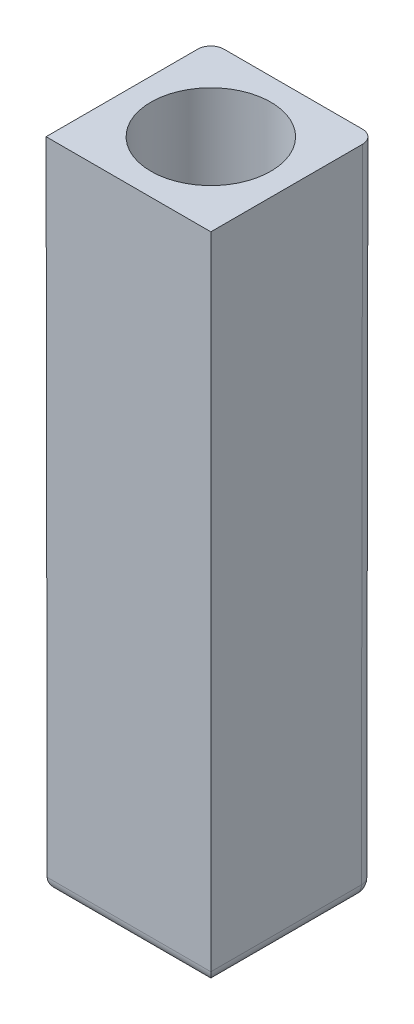
ISO-10303-21;
HEADER;
FILE_DESCRIPTION(('STEP AP214'),'2;1');
FILE_NAME('part.step','',(''),(''),'','','');
FILE_SCHEMA(('AUTOMOTIVE_DESIGN { 1 0 10303 214 1 1 1 1 }'));
ENDSEC;
DATA;
#1=APPLICATION_CONTEXT('core data for automotive mechanical design processes');
#2=APPLICATION_PROTOCOL_DEFINITION('international standard','automotive_design',2000,#1);
#3=PRODUCT_CONTEXT('',#1,'mechanical');
#4=PRODUCT('Part','Part','',(#3));
#5=PRODUCT_RELATED_PRODUCT_CATEGORY('part','',(#4));
#6=PRODUCT_DEFINITION_FORMATION('','',#4);
#7=PRODUCT_DEFINITION_CONTEXT('part definition',#1,'design');
#8=PRODUCT_DEFINITION('design','',#6,#7);
#9=PRODUCT_DEFINITION_SHAPE('','',#8);
#10=(LENGTH_UNIT() NAMED_UNIT(*) SI_UNIT(.MILLI.,.METRE.));
#11=(NAMED_UNIT(*) PLANE_ANGLE_UNIT() SI_UNIT($,.RADIAN.));
#12=(NAMED_UNIT(*) SI_UNIT($,.STERADIAN.) SOLID_ANGLE_UNIT());
#13=UNCERTAINTY_MEASURE_WITH_UNIT(LENGTH_MEASURE(1.E-05),#10,'distance_accuracy_value','');
#14=(GEOMETRIC_REPRESENTATION_CONTEXT(3) GLOBAL_UNCERTAINTY_ASSIGNED_CONTEXT((#13)) GLOBAL_UNIT_ASSIGNED_CONTEXT((#10,
#11,#12)) REPRESENTATION_CONTEXT('',''));
#15=CARTESIAN_POINT('',(0.,0.,0.));
#16=DIRECTION('',(0.,0.,1.));
#17=DIRECTION('',(1.,0.,0.));
#18=AXIS2_PLACEMENT_3D('',#15,#16,#17);
#19=CARTESIAN_POINT('',(0.,100.,0.));
#20=DIRECTION('',(0.,1.,0.));
#21=DIRECTION('',(0.,0.,1.));
#22=AXIS2_PLACEMENT_3D('',#19,#20,#21);
#23=PLANE('',#22);
#24=DIRECTION('',(0.,0.,1.));
#25=VECTOR('',#24,1.);
#26=CARTESIAN_POINT('',(12.5872664847521,100.,-12.5));
#27=LINE('',#26,#25);
#28=CARTESIAN_POINT('',(12.5872664847521,100.,12.5872664847521));
#29=VERTEX_POINT('',#28);
#30=CARTESIAN_POINT('',(12.5872664847521,100.,-10.5872672462956));
#31=VERTEX_POINT('',#30);
#32=EDGE_CURVE('E140',#29,#31,#27,.F.);
#33=ORIENTED_EDGE('',*,*,#32,.T.);
#34=CARTESIAN_POINT('',(10.5872657232083,100.,-10.5872657232083));
#35=DIRECTION('',(0.,1.,0.));
#36=DIRECTION('',(-0.707106781186548,0.,0.707106781186548));
#37=AXIS2_PLACEMENT_3D('',#34,#35,#36);
#38=ELLIPSE('',#37,2.00000152308729,2.);
#39=CARTESIAN_POINT('',(10.5872672462956,100.,-12.5872664847521));
#40=VERTEX_POINT('',#39);
#41=EDGE_CURVE('E153',#31,#40,#38,.T.);
#42=ORIENTED_EDGE('',*,*,#41,.T.);
#43=DIRECTION('',(1.,0.,0.));
#44=VECTOR('',#43,1.);
#45=CARTESIAN_POINT('',(-12.5,100.,-12.5872664847521));
#46=LINE('',#45,#44);
#47=CARTESIAN_POINT('',(-10.5872672462956,100.,-12.5872664847521));
#48=VERTEX_POINT('',#47);
#49=EDGE_CURVE('E118',#40,#48,#46,.F.);
#50=ORIENTED_EDGE('',*,*,#49,.T.);
#51=CARTESIAN_POINT('',(-10.5872657232083,100.,-10.5872657232083));
#52=DIRECTION('',(0.,1.,0.));
#53=DIRECTION('',(0.707106781186548,0.,0.707106781186548));
#54=AXIS2_PLACEMENT_3D('',#51,#52,#53);
#55=ELLIPSE('',#54,2.00000152308729,2.);
#56=CARTESIAN_POINT('',(-12.5872664847521,100.,-10.5872672462956));
#57=VERTEX_POINT('',#56);
#58=EDGE_CURVE('E115',#48,#57,#55,.T.);
#59=ORIENTED_EDGE('',*,*,#58,.T.);
#60=DIRECTION('',(0.,0.,-1.));
#61=VECTOR('',#60,1.);
#62=CARTESIAN_POINT('',(-12.5872664847521,100.,-12.5));
#63=LINE('',#62,#61);
#64=CARTESIAN_POINT('',(-12.5872664847521,100.,12.5872664847521));
#65=VERTEX_POINT('',#64);
#66=EDGE_CURVE('E106',#57,#65,#63,.F.);
#67=ORIENTED_EDGE('',*,*,#66,.T.);
#68=DIRECTION('',(-1.,0.,0.));
#69=VECTOR('',#68,1.);
#70=CARTESIAN_POINT('',(-12.5,100.,12.5872664847521));
#71=LINE('',#70,#69);
#72=EDGE_CURVE('E111',#65,#29,#71,.F.);
#73=ORIENTED_EDGE('',*,*,#72,.T.);
#74=EDGE_LOOP('',(#33,#42,#50,#59,#67,#73));
#75=FACE_BOUND('',#74,.T.);
#76=CARTESIAN_POINT('',(0.,100.,0.));
#77=DIRECTION('',(0.,1.,0.));
#78=DIRECTION('',(0.,0.,1.));
#79=AXIS2_PLACEMENT_3D('',#76,#77,#78);
#80=CIRCLE('',#79,9.15973351524787);
#81=CARTESIAN_POINT('',(0.,100.,9.15973351524787));
#82=VERTEX_POINT('',#81);
#83=EDGE_CURVE('E137',#82,#82,#80,.T.);
#84=ORIENTED_EDGE('',*,*,#83,.F.);
#85=EDGE_LOOP('',(#84));
#86=FACE_BOUND('',#85,.T.);
#87=ADVANCED_FACE('F39',(#75,#86),#23,.T.);
#88=CARTESIAN_POINT('',(0.,0.,0.));
#89=DIRECTION('',(0.,1.,0.));
#90=DIRECTION('',(0.,0.,1.));
#91=AXIS2_PLACEMENT_3D('',#88,#89,#90);
#92=PLANE('',#91);
#93=DIRECTION('',(1.,0.,0.));
#94=VECTOR('',#93,1.);
#95=CARTESIAN_POINT('',(0.,0.,-10.5017445681513));
#96=LINE('',#95,#94);
#97=CARTESIAN_POINT('',(-10.5017445681513,0.,-10.5017445681513));
#98=VERTEX_POINT('',#97);
#99=CARTESIAN_POINT('',(10.5017445681512,0.,-10.5017445681513));
#100=VERTEX_POINT('',#99);
#101=EDGE_CURVE('E158',#98,#100,#96,.T.);
#102=ORIENTED_EDGE('',*,*,#101,.T.);
#103=DIRECTION('',(0.,0.,1.));
#104=VECTOR('',#103,1.);
#105=CARTESIAN_POINT('',(10.5017445681512,0.,0.));
#106=LINE('',#105,#104);
#107=CARTESIAN_POINT('',(10.5017445681513,0.,10.5017445681513));
#108=VERTEX_POINT('',#107);
#109=EDGE_CURVE('E48',#100,#108,#106,.T.);
#110=ORIENTED_EDGE('',*,*,#109,.T.);
#111=DIRECTION('',(-1.,0.,0.));
#112=VECTOR('',#111,1.);
#113=CARTESIAN_POINT('',(0.,0.,10.5017445681513));
#114=LINE('',#113,#112);
#115=CARTESIAN_POINT('',(-10.5017445681513,0.,10.5017445681513));
#116=VERTEX_POINT('',#115);
#117=EDGE_CURVE('E63',#108,#116,#114,.T.);
#118=ORIENTED_EDGE('',*,*,#117,.T.);
#119=DIRECTION('',(0.,0.,-1.));
#120=VECTOR('',#119,1.);
#121=CARTESIAN_POINT('',(-10.5017445681513,0.,0.));
#122=LINE('',#121,#120);
#123=EDGE_CURVE('E160',#116,#98,#122,.T.);
#124=ORIENTED_EDGE('',*,*,#123,.T.);
#125=EDGE_LOOP('',(#102,#110,#118,#124));
#126=FACE_BOUND('',#125,.T.);
#127=CARTESIAN_POINT('',(0.,0.,0.));
#128=DIRECTION('',(0.,1.,0.));
#129=DIRECTION('',(0.,0.,1.));
#130=AXIS2_PLACEMENT_3D('',#127,#128,#129);
#131=CIRCLE('',#130,9.247);
#132=CARTESIAN_POINT('',(0.,0.,9.247));
#133=VERTEX_POINT('',#132);
#134=EDGE_CURVE('E141',#133,#133,#131,.T.);
#135=ORIENTED_EDGE('',*,*,#134,.T.);
#136=EDGE_LOOP('',(#135));
#137=FACE_BOUND('',#136,.T.);
#138=ADVANCED_FACE('F223',(#126,#137),#92,.F.);
#139=CARTESIAN_POINT('',(12.5,0.,-12.5));
#140=DIRECTION('',(0.999999619228249,-0.000872664515235152,0.));
#141=DIRECTION('',(0.000872664515235152,0.999999619228249,0.));
#142=AXIS2_PLACEMENT_3D('',#139,#140,#141);
#143=PLANE('',#142);
#144=DIRECTION('',(0.,0.,-1.));
#145=VECTOR('',#144,1.);
#146=CARTESIAN_POINT('',(12.5017438066077,1.99825467096953,-12.5));
#147=LINE('',#146,#145);
#148=CARTESIAN_POINT('',(12.5017438066078,1.99825467096953,12.5017438066078));
#149=VERTEX_POINT('',#148);
#150=CARTESIAN_POINT('',(12.5017438066077,1.99825467096953,-10.5017445681513));
#151=VERTEX_POINT('',#150);
#152=EDGE_CURVE('E148',#149,#151,#147,.T.);
#153=ORIENTED_EDGE('',*,*,#152,.T.);
#154=DIRECTION('',(0.000872664182949409,0.999999238456934,-0.00087266418294941));
#155=VECTOR('',#154,1.);
#156=CARTESIAN_POINT('',(12.500001523085,0.00174532637218487,-10.5000022846285));
#157=LINE('',#156,#155);
#158=EDGE_CURVE('E150',#151,#31,#157,.T.);
#159=ORIENTED_EDGE('',*,*,#158,.T.);
#160=ORIENTED_EDGE('',*,*,#32,.F.);
#161=DIRECTION('',(-0.00087266418294941,-0.999999238456934,-0.00087266418294941));
#162=VECTOR('',#161,1.);
#163=CARTESIAN_POINT('',(12.4999809614306,-0.0218165879594513,12.4999809614306));
#164=LINE('',#163,#162);
#165=EDGE_CURVE('E128',#29,#149,#164,.T.);
#166=ORIENTED_EDGE('',*,*,#165,.T.);
#167=EDGE_LOOP('',(#153,#159,#160,#166));
#168=FACE_BOUND('',#167,.T.);
#169=ADVANCED_FACE('F202',(#168),#143,.T.);
#170=CARTESIAN_POINT('',(-12.5,0.,-12.5));
#171=DIRECTION('',(0.,-0.000872664515235152,-0.999999619228249));
#172=DIRECTION('',(0.,0.999999619228249,-0.000872664515235152));
#173=AXIS2_PLACEMENT_3D('',#170,#171,#172);
#174=PLANE('',#173);
#175=ORIENTED_EDGE('',*,*,#49,.F.);
#176=DIRECTION('',(0.000872664182949409,0.999999238456934,-0.00087266418294941));
#177=VECTOR('',#176,1.);
#178=CARTESIAN_POINT('',(10.4999832460591,-0.0200712615872664,-12.4999824845156));
#179=LINE('',#178,#177);
#180=CARTESIAN_POINT('',(10.5017445681512,1.99825467096953,-12.5017438066077));
#181=VERTEX_POINT('',#180);
#182=EDGE_CURVE('E145',#40,#181,#179,.F.);
#183=ORIENTED_EDGE('',*,*,#182,.T.);
#184=DIRECTION('',(-1.,0.,0.));
#185=VECTOR('',#184,1.);
#186=CARTESIAN_POINT('',(-12.5,1.99825467096953,-12.5017438066077));
#187=LINE('',#186,#185);
#188=CARTESIAN_POINT('',(-10.5017445681513,1.99825467096953,-12.5017438066077));
#189=VERTEX_POINT('',#188);
#190=EDGE_CURVE('E127',#181,#189,#187,.T.);
#191=ORIENTED_EDGE('',*,*,#190,.T.);
#192=DIRECTION('',(-0.00087266418294941,0.999999238456934,-0.00087266418294941));
#193=VECTOR('',#192,1.);
#194=CARTESIAN_POINT('',(-10.5000022846285,0.00174532637218487,-12.500001523085));
#195=LINE('',#194,#193);
#196=EDGE_CURVE('E143',#189,#48,#195,.T.);
#197=ORIENTED_EDGE('',*,*,#196,.T.);
#198=EDGE_LOOP('',(#175,#183,#191,#197));
#199=FACE_BOUND('',#198,.T.);
#200=ADVANCED_FACE('F208',(#199),#174,.T.);
#201=CARTESIAN_POINT('',(-12.5,0.,-12.5));
#202=DIRECTION('',(-0.999999619228249,-0.000872664515235152,0.));
#203=DIRECTION('',(0.000872664515235152,-0.999999619228249,0.));
#204=AXIS2_PLACEMENT_3D('',#201,#202,#203);
#205=PLANE('',#204);
#206=ORIENTED_EDGE('',*,*,#66,.F.);
#207=DIRECTION('',(-0.00087266418294941,0.999999238456934,-0.00087266418294941));
#208=VECTOR('',#207,1.);
#209=CARTESIAN_POINT('',(-12.500001523085,0.00174532637218487,-10.5000022846285));
#210=LINE('',#209,#208);
#211=CARTESIAN_POINT('',(-12.5017438066078,1.99825467096953,-10.5017445681513));
#212=VERTEX_POINT('',#211);
#213=EDGE_CURVE('E156',#57,#212,#210,.F.);
#214=ORIENTED_EDGE('',*,*,#213,.T.);
#215=DIRECTION('',(0.,0.,1.));
#216=VECTOR('',#215,1.);
#217=CARTESIAN_POINT('',(-12.5017438066078,1.99825467096953,-12.5));
#218=LINE('',#217,#216);
#219=CARTESIAN_POINT('',(-12.5017438066078,1.99825467096953,12.5017438066078));
#220=VERTEX_POINT('',#219);
#221=EDGE_CURVE('E124',#212,#220,#218,.T.);
#222=ORIENTED_EDGE('',*,*,#221,.T.);
#223=DIRECTION('',(0.000872664182949409,-0.999999238456934,-0.00087266418294941));
#224=VECTOR('',#223,1.);
#225=CARTESIAN_POINT('',(-12.5,0.,12.5));
#226=LINE('',#225,#224);
#227=EDGE_CURVE('E121',#65,#220,#226,.T.);
#228=ORIENTED_EDGE('',*,*,#227,.F.);
#229=EDGE_LOOP('',(#206,#214,#222,#228));
#230=FACE_BOUND('',#229,.T.);
#231=ADVANCED_FACE('F122',(#230),#205,.T.);
#232=CARTESIAN_POINT('',(-12.5,0.,12.5));
#233=DIRECTION('',(0.,-0.000872664515235152,0.999999619228249));
#234=DIRECTION('',(0.,-0.999999619228249,-0.000872664515235152));
#235=AXIS2_PLACEMENT_3D('',#232,#233,#234);
#236=PLANE('',#235);
#237=ORIENTED_EDGE('',*,*,#227,.T.);
#238=DIRECTION('',(1.,0.,0.));
#239=VECTOR('',#238,1.);
#240=CARTESIAN_POINT('',(-12.5,1.99825467096953,12.5017438066078));
#241=LINE('',#240,#239);
#242=EDGE_CURVE('E11',#220,#149,#241,.T.);
#243=ORIENTED_EDGE('',*,*,#242,.T.);
#244=ORIENTED_EDGE('',*,*,#165,.F.);
#245=ORIENTED_EDGE('',*,*,#72,.F.);
#246=EDGE_LOOP('',(#237,#243,#244,#245));
#247=FACE_BOUND('',#246,.T.);
#248=ADVANCED_FACE('F130',(#247),#236,.T.);
#249=CARTESIAN_POINT('',(0.,0.,0.));
#250=DIRECTION('',(0.,-1.,0.));
#251=DIRECTION('',(0.,0.,1.));
#252=AXIS2_PLACEMENT_3D('',#249,#250,#251);
#253=CONICAL_SURFACE('',#252,9.247,0.000872664625997167);
#254=ORIENTED_EDGE('',*,*,#83,.T.);
#255=EDGE_LOOP('',(#254));
#256=FACE_BOUND('',#255,.T.);
#257=ORIENTED_EDGE('',*,*,#134,.F.);
#258=EDGE_LOOP('',(#257));
#259=FACE_BOUND('',#258,.T.);
#260=ADVANCED_FACE('F234',(#256,#259),#253,.F.);
#261=CARTESIAN_POINT('',(-10.5000022846285,0.00349065540265517,-10.5000022846285));
#262=DIRECTION('',(0.00087266418294941,-0.999999238456934,0.00087266418294941));
#263=DIRECTION('',(0.999999619228249,0.000872664515235152,0.));
#264=AXIS2_PLACEMENT_3D('',#261,#262,#263);
#265=CYLINDRICAL_SURFACE('',#264,2.);
#266=ORIENTED_EDGE('',*,*,#58,.F.);
#267=ORIENTED_EDGE('',*,*,#196,.F.);
#268=CARTESIAN_POINT('',(-10.5017445681513,2.,-10.5017445681513));
#269=DIRECTION('',(0.000872664182949483,-0.999999238456934,0.000872664182949483));
#270=DIRECTION('',(0.,-0.000872664515235225,-0.999999619228249));
#271=AXIS2_PLACEMENT_3D('',#268,#269,#270);
#272=CIRCLE('',#271,2.);
#273=EDGE_CURVE('E43',#212,#189,#272,.T.);
#274=ORIENTED_EDGE('',*,*,#273,.F.);
#275=ORIENTED_EDGE('',*,*,#213,.F.);
#276=EDGE_LOOP('',(#266,#267,#274,#275));
#277=FACE_BOUND('',#276,.T.);
#278=ADVANCED_FACE('F41',(#277),#265,.T.);
#279=CARTESIAN_POINT('',(-10.5017445681513,2.,-12.5));
#280=DIRECTION('',(0.,0.,-1.));
#281=DIRECTION('',(-1.,0.,0.));
#282=AXIS2_PLACEMENT_3D('',#279,#280,#281);
#283=CYLINDRICAL_SURFACE('',#282,2.);
#284=CARTESIAN_POINT('',(-10.5017445681513,2.,10.5017445681513));
#285=DIRECTION('',(-0.707106781186548,0.,-0.707106781186547));
#286=DIRECTION('',(0.707106781186547,0.,-0.707106781186548));
#287=AXIS2_PLACEMENT_3D('',#284,#285,#286);
#288=ELLIPSE('',#287,2.82842712474619,2.);
#289=EDGE_CURVE('E176',#220,#116,#288,.F.);
#290=ORIENTED_EDGE('',*,*,#289,.F.);
#291=ORIENTED_EDGE('',*,*,#221,.F.);
#292=CARTESIAN_POINT('',(-10.5017445681513,2.,-10.5017445681513));
#293=DIRECTION('',(0.,0.,-1.));
#294=DIRECTION('',(-1.,0.,0.));
#295=AXIS2_PLACEMENT_3D('',#292,#293,#294);
#296=CIRCLE('',#295,2.);
#297=EDGE_CURVE('E178',#98,#212,#296,.T.);
#298=ORIENTED_EDGE('',*,*,#297,.F.);
#299=ORIENTED_EDGE('',*,*,#123,.F.);
#300=EDGE_LOOP('',(#290,#291,#298,#299));
#301=FACE_BOUND('',#300,.T.);
#302=ADVANCED_FACE('F197',(#301),#283,.T.);
#303=CARTESIAN_POINT('',(-10.5017445681513,2.,-10.5017445681513));
#304=DIRECTION('',(0.,-1.,0.));
#305=DIRECTION('',(0.,0.,-1.));
#306=AXIS2_PLACEMENT_3D('',#303,#304,#305);
#307=SPHERICAL_SURFACE('',#306,2.);
#308=ORIENTED_EDGE('',*,*,#297,.T.);
#309=ORIENTED_EDGE('',*,*,#273,.T.);
#310=CARTESIAN_POINT('',(-10.5017445681513,2.,-10.5017445681512));
#311=DIRECTION('',(-1.,0.,0.));
#312=DIRECTION('',(0.,-1.,0.));
#313=AXIS2_PLACEMENT_3D('',#310,#311,#312);
#314=CIRCLE('',#313,2.);
#315=EDGE_CURVE('E173',#98,#189,#314,.F.);
#316=ORIENTED_EDGE('',*,*,#315,.F.);
#317=EDGE_LOOP('',(#308,#309,#316));
#318=FACE_BOUND('',#317,.T.);
#319=ADVANCED_FACE('F214',(#318),#307,.T.);
#320=CARTESIAN_POINT('',(-12.5,2.,10.5017445681513));
#321=DIRECTION('',(-1.,0.,0.));
#322=DIRECTION('',(0.,0.,1.));
#323=AXIS2_PLACEMENT_3D('',#320,#321,#322);
#324=CYLINDRICAL_SURFACE('',#323,2.);
#325=ORIENTED_EDGE('',*,*,#289,.T.);
#326=ORIENTED_EDGE('',*,*,#117,.F.);
#327=CARTESIAN_POINT('',(10.5017445681512,2.,10.5017445681513));
#328=DIRECTION('',(-0.707106781186547,0.,0.707106781186548));
#329=DIRECTION('',(-0.707106781186548,0.,-0.707106781186547));
#330=AXIS2_PLACEMENT_3D('',#327,#328,#329);
#331=ELLIPSE('',#330,2.82842712474619,2.);
#332=EDGE_CURVE('E56',#149,#108,#331,.F.);
#333=ORIENTED_EDGE('',*,*,#332,.F.);
#334=ORIENTED_EDGE('',*,*,#242,.F.);
#335=EDGE_LOOP('',(#325,#326,#333,#334));
#336=FACE_BOUND('',#335,.T.);
#337=ADVANCED_FACE('F200',(#336),#324,.T.);
#338=CARTESIAN_POINT('',(-12.5,2.,-10.5017445681513));
#339=DIRECTION('',(1.,0.,0.));
#340=DIRECTION('',(0.,0.,-1.));
#341=AXIS2_PLACEMENT_3D('',#338,#339,#340);
#342=CYLINDRICAL_SURFACE('',#341,2.);
#343=ORIENTED_EDGE('',*,*,#315,.T.);
#344=ORIENTED_EDGE('',*,*,#190,.F.);
#345=CARTESIAN_POINT('',(10.5017445681512,2.,-10.5017445681513));
#346=DIRECTION('',(1.,0.,0.));
#347=DIRECTION('',(0.,0.,-1.));
#348=AXIS2_PLACEMENT_3D('',#345,#346,#347);
#349=CIRCLE('',#348,2.);
#350=EDGE_CURVE('E169',#100,#181,#349,.T.);
#351=ORIENTED_EDGE('',*,*,#350,.F.);
#352=ORIENTED_EDGE('',*,*,#101,.F.);
#353=EDGE_LOOP('',(#343,#344,#351,#352));
#354=FACE_BOUND('',#353,.T.);
#355=ADVANCED_FACE('F212',(#354),#342,.T.);
#356=CARTESIAN_POINT('',(10.5017445681512,2.,-12.5));
#357=DIRECTION('',(0.,0.,1.));
#358=DIRECTION('',(1.,0.,0.));
#359=AXIS2_PLACEMENT_3D('',#356,#357,#358);
#360=CYLINDRICAL_SURFACE('',#359,2.);
#361=ORIENTED_EDGE('',*,*,#332,.T.);
#362=ORIENTED_EDGE('',*,*,#109,.F.);
#363=CARTESIAN_POINT('',(10.5017445681512,2.,-10.5017445681513));
#364=DIRECTION('',(0.,0.,-1.));
#365=DIRECTION('',(0.,1.,0.));
#366=AXIS2_PLACEMENT_3D('',#363,#364,#365);
#367=CIRCLE('',#366,2.);
#368=EDGE_CURVE('E166',#151,#100,#367,.T.);
#369=ORIENTED_EDGE('',*,*,#368,.F.);
#370=ORIENTED_EDGE('',*,*,#152,.F.);
#371=EDGE_LOOP('',(#361,#362,#369,#370));
#372=FACE_BOUND('',#371,.T.);
#373=ADVANCED_FACE('F247',(#372),#360,.T.);
#374=CARTESIAN_POINT('',(10.5017445681512,2.,-10.5017445681513));
#375=DIRECTION('',(0.,-1.,0.));
#376=DIRECTION('',(1.,0.,0.));
#377=AXIS2_PLACEMENT_3D('',#374,#375,#376);
#378=SPHERICAL_SURFACE('',#377,2.);
#379=ORIENTED_EDGE('',*,*,#368,.T.);
#380=ORIENTED_EDGE('',*,*,#350,.T.);
#381=CARTESIAN_POINT('',(10.5017445681512,2.,-10.5017445681512));
#382=DIRECTION('',(-0.000872664182949479,-0.999999238456934,0.000872664182949482));
#383=DIRECTION('',(0.,-0.000872664515235224,-0.999999619228249));
#384=AXIS2_PLACEMENT_3D('',#381,#382,#383);
#385=CIRCLE('',#384,2.);
#386=EDGE_CURVE('E164',#151,#181,#385,.F.);
#387=ORIENTED_EDGE('',*,*,#386,.F.);
#388=EDGE_LOOP('',(#379,#380,#387));
#389=FACE_BOUND('',#388,.T.);
#390=ADVANCED_FACE('F244',(#389),#378,.T.);
#391=CARTESIAN_POINT('',(10.4999832460591,-0.0183259325567961,-10.4999832460591));
#392=DIRECTION('',(-0.000872664182949409,-0.999999238456934,0.00087266418294941));
#393=DIRECTION('',(0.,-0.000872664515235152,-0.999999619228249));
#394=AXIS2_PLACEMENT_3D('',#391,#392,#393);
#395=CYLINDRICAL_SURFACE('',#394,2.);
#396=ORIENTED_EDGE('',*,*,#41,.F.);
#397=ORIENTED_EDGE('',*,*,#158,.F.);
#398=ORIENTED_EDGE('',*,*,#386,.T.);
#399=ORIENTED_EDGE('',*,*,#182,.F.);
#400=EDGE_LOOP('',(#396,#397,#398,#399));
#401=FACE_BOUND('',#400,.T.);
#402=ADVANCED_FACE('F206',(#401),#395,.T.);
#403=CLOSED_SHELL('',(#87,#138,#169,#200,#231,#248,#260,#278,#302,#319,#337,#355,#373,#390,#402));
#404=MANIFOLD_SOLID_BREP('B2',#403);
#405=ADVANCED_BREP_SHAPE_REPRESENTATION('',(#18,#404),#14);
#406=SHAPE_DEFINITION_REPRESENTATION(#9,#405);
ENDSEC;
END-ISO-10303-21;
